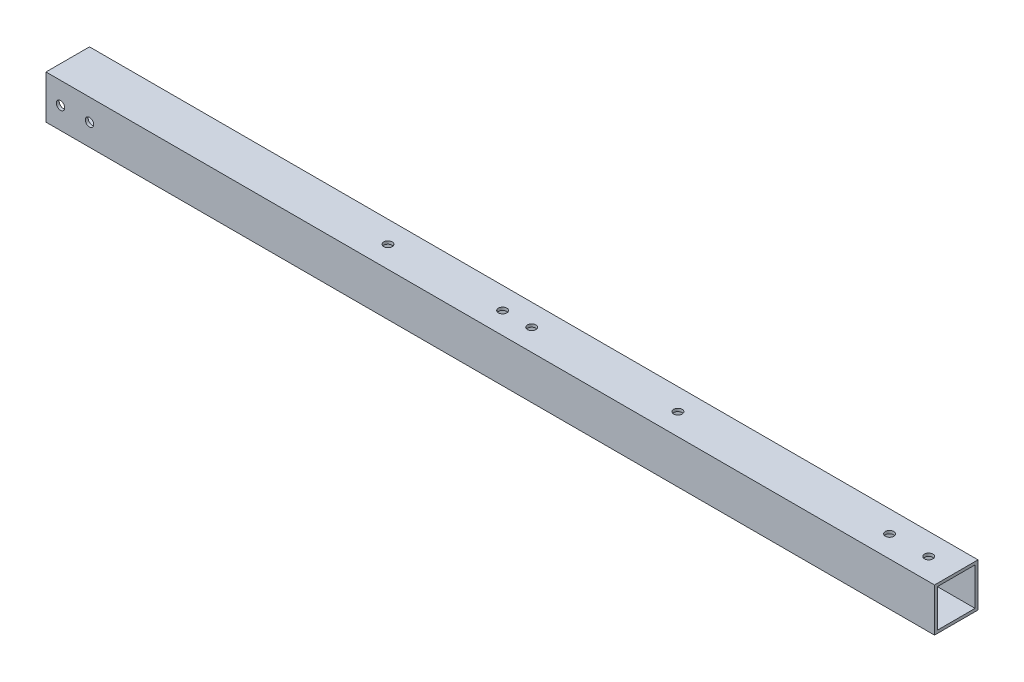
ISO-10303-21;
HEADER;
FILE_DESCRIPTION(('STEP AP214'),'2;1');
FILE_NAME('part.step','',(''),(''),'','','');
FILE_SCHEMA(('AUTOMOTIVE_DESIGN { 1 0 10303 214 1 1 1 1 }'));
ENDSEC;
DATA;
#1=APPLICATION_CONTEXT('core data for automotive mechanical design processes');
#2=APPLICATION_PROTOCOL_DEFINITION('international standard','automotive_design',2000,#1);
#3=PRODUCT_CONTEXT('',#1,'mechanical');
#4=PRODUCT('Part','Part','',(#3));
#5=PRODUCT_RELATED_PRODUCT_CATEGORY('part','',(#4));
#6=PRODUCT_DEFINITION_FORMATION('','',#4);
#7=PRODUCT_DEFINITION_CONTEXT('part definition',#1,'design');
#8=PRODUCT_DEFINITION('design','',#6,#7);
#9=PRODUCT_DEFINITION_SHAPE('','',#8);
#10=(LENGTH_UNIT() NAMED_UNIT(*) SI_UNIT(.MILLI.,.METRE.));
#11=(NAMED_UNIT(*) PLANE_ANGLE_UNIT() SI_UNIT($,.RADIAN.));
#12=(NAMED_UNIT(*) SI_UNIT($,.STERADIAN.) SOLID_ANGLE_UNIT());
#13=UNCERTAINTY_MEASURE_WITH_UNIT(LENGTH_MEASURE(1.E-05),#10,'distance_accuracy_value','');
#14=(GEOMETRIC_REPRESENTATION_CONTEXT(3) GLOBAL_UNCERTAINTY_ASSIGNED_CONTEXT((#13)) GLOBAL_UNIT_ASSIGNED_CONTEXT((#10,
#11,#12)) REPRESENTATION_CONTEXT('',''));
#15=CARTESIAN_POINT('',(0.,0.,0.));
#16=DIRECTION('',(0.,0.,1.));
#17=DIRECTION('',(1.,0.,0.));
#18=AXIS2_PLACEMENT_3D('',#15,#16,#17);
#19=CARTESIAN_POINT('',(306.44,0.,0.));
#20=DIRECTION('',(-1.,0.,0.));
#21=DIRECTION('',(0.,0.,1.));
#22=AXIS2_PLACEMENT_3D('',#19,#20,#21);
#23=PLANE('',#22);
#24=DIRECTION('',(0.,1.,0.));
#25=VECTOR('',#24,1.);
#26=CARTESIAN_POINT('',(306.44,-7.5,-7.5));
#27=LINE('',#26,#25);
#28=CARTESIAN_POINT('',(306.44,-7.5,-7.5));
#29=VERTEX_POINT('',#28);
#30=CARTESIAN_POINT('',(306.44,7.5,-7.5));
#31=VERTEX_POINT('',#30);
#32=EDGE_CURVE('E146',#29,#31,#27,.T.);
#33=ORIENTED_EDGE('',*,*,#32,.T.);
#34=DIRECTION('',(0.,0.,1.));
#35=VECTOR('',#34,1.);
#36=CARTESIAN_POINT('',(306.44,7.5,7.5));
#37=LINE('',#36,#35);
#38=CARTESIAN_POINT('',(306.44,7.5,7.5));
#39=VERTEX_POINT('',#38);
#40=EDGE_CURVE('E149',#31,#39,#37,.T.);
#41=ORIENTED_EDGE('',*,*,#40,.T.);
#42=DIRECTION('',(0.,-1.,0.));
#43=VECTOR('',#42,1.);
#44=CARTESIAN_POINT('',(306.44,-7.5,7.5));
#45=LINE('',#44,#43);
#46=CARTESIAN_POINT('',(306.44,-7.5,7.5));
#47=VERTEX_POINT('',#46);
#48=EDGE_CURVE('E152',#39,#47,#45,.T.);
#49=ORIENTED_EDGE('',*,*,#48,.T.);
#50=DIRECTION('',(0.,0.,-1.));
#51=VECTOR('',#50,1.);
#52=CARTESIAN_POINT('',(306.44,-7.5,7.5));
#53=LINE('',#52,#51);
#54=EDGE_CURVE('E154',#47,#29,#53,.T.);
#55=ORIENTED_EDGE('',*,*,#54,.T.);
#56=EDGE_LOOP('',(#33,#41,#49,#55));
#57=FACE_BOUND('',#56,.T.);
#58=DIRECTION('',(0.,0.,-1.));
#59=VECTOR('',#58,1.);
#60=CARTESIAN_POINT('',(306.44,-6.5,6.5));
#61=LINE('',#60,#59);
#62=CARTESIAN_POINT('',(306.44,-6.5,6.5));
#63=VERTEX_POINT('',#62);
#64=CARTESIAN_POINT('',(306.44,-6.5,-6.5));
#65=VERTEX_POINT('',#64);
#66=EDGE_CURVE('E108',#63,#65,#61,.T.);
#67=ORIENTED_EDGE('',*,*,#66,.F.);
#68=DIRECTION('',(0.,-1.,0.));
#69=VECTOR('',#68,1.);
#70=CARTESIAN_POINT('',(306.44,-6.5,6.5));
#71=LINE('',#70,#69);
#72=CARTESIAN_POINT('',(306.44,6.5,6.5));
#73=VERTEX_POINT('',#72);
#74=EDGE_CURVE('E130',#73,#63,#71,.T.);
#75=ORIENTED_EDGE('',*,*,#74,.F.);
#76=DIRECTION('',(0.,0.,1.));
#77=VECTOR('',#76,1.);
#78=CARTESIAN_POINT('',(306.44,6.5,6.5));
#79=LINE('',#78,#77);
#80=CARTESIAN_POINT('',(306.44,6.5,-6.5));
#81=VERTEX_POINT('',#80);
#82=EDGE_CURVE('E128',#81,#73,#79,.T.);
#83=ORIENTED_EDGE('',*,*,#82,.F.);
#84=DIRECTION('',(0.,1.,0.));
#85=VECTOR('',#84,1.);
#86=CARTESIAN_POINT('',(306.44,-6.5,-6.5));
#87=LINE('',#86,#85);
#88=EDGE_CURVE('E116',#65,#81,#87,.T.);
#89=ORIENTED_EDGE('',*,*,#88,.F.);
#90=EDGE_LOOP('',(#67,#75,#83,#89));
#91=FACE_BOUND('',#90,.T.);
#92=ADVANCED_FACE('F41',(#57,#91),#23,.F.);
#93=CARTESIAN_POINT('',(0.,0.,0.));
#94=DIRECTION('',(-1.,0.,0.));
#95=DIRECTION('',(0.,0.,1.));
#96=AXIS2_PLACEMENT_3D('',#93,#94,#95);
#97=PLANE('',#96);
#98=DIRECTION('',(0.,1.,0.));
#99=VECTOR('',#98,1.);
#100=CARTESIAN_POINT('',(0.,-7.5,-7.5));
#101=LINE('',#100,#99);
#102=CARTESIAN_POINT('',(0.,-7.5,-7.5));
#103=VERTEX_POINT('',#102);
#104=CARTESIAN_POINT('',(0.,7.5,-7.5));
#105=VERTEX_POINT('',#104);
#106=EDGE_CURVE('E124',#103,#105,#101,.T.);
#107=ORIENTED_EDGE('',*,*,#106,.F.);
#108=DIRECTION('',(0.,0.,-1.));
#109=VECTOR('',#108,1.);
#110=CARTESIAN_POINT('',(0.,-7.5,7.5));
#111=LINE('',#110,#109);
#112=CARTESIAN_POINT('',(0.,-7.5,7.5));
#113=VERTEX_POINT('',#112);
#114=EDGE_CURVE('E150',#113,#103,#111,.T.);
#115=ORIENTED_EDGE('',*,*,#114,.F.);
#116=DIRECTION('',(0.,-1.,0.));
#117=VECTOR('',#116,1.);
#118=CARTESIAN_POINT('',(0.,-7.5,7.5));
#119=LINE('',#118,#117);
#120=CARTESIAN_POINT('',(0.,7.5,7.5));
#121=VERTEX_POINT('',#120);
#122=EDGE_CURVE('E161',#121,#113,#119,.T.);
#123=ORIENTED_EDGE('',*,*,#122,.F.);
#124=DIRECTION('',(0.,0.,1.));
#125=VECTOR('',#124,1.);
#126=CARTESIAN_POINT('',(0.,7.5,7.5));
#127=LINE('',#126,#125);
#128=EDGE_CURVE('E159',#105,#121,#127,.T.);
#129=ORIENTED_EDGE('',*,*,#128,.F.);
#130=EDGE_LOOP('',(#107,#115,#123,#129));
#131=FACE_BOUND('',#130,.T.);
#132=DIRECTION('',(0.,-1.,0.));
#133=VECTOR('',#132,1.);
#134=CARTESIAN_POINT('',(0.,-6.5,6.5));
#135=LINE('',#134,#133);
#136=CARTESIAN_POINT('',(0.,6.5,6.5));
#137=VERTEX_POINT('',#136);
#138=CARTESIAN_POINT('',(0.,-6.5,6.5));
#139=VERTEX_POINT('',#138);
#140=EDGE_CURVE('E117',#137,#139,#135,.T.);
#141=ORIENTED_EDGE('',*,*,#140,.T.);
#142=DIRECTION('',(0.,0.,-1.));
#143=VECTOR('',#142,1.);
#144=CARTESIAN_POINT('',(0.,-6.5,6.5));
#145=LINE('',#144,#143);
#146=CARTESIAN_POINT('',(0.,-6.5,-6.5));
#147=VERTEX_POINT('',#146);
#148=EDGE_CURVE('E66',#139,#147,#145,.T.);
#149=ORIENTED_EDGE('',*,*,#148,.T.);
#150=DIRECTION('',(0.,1.,0.));
#151=VECTOR('',#150,1.);
#152=CARTESIAN_POINT('',(0.,-6.5,-6.5));
#153=LINE('',#152,#151);
#154=CARTESIAN_POINT('',(0.,6.5,-6.5));
#155=VERTEX_POINT('',#154);
#156=EDGE_CURVE('E123',#147,#155,#153,.T.);
#157=ORIENTED_EDGE('',*,*,#156,.T.);
#158=DIRECTION('',(0.,0.,1.));
#159=VECTOR('',#158,1.);
#160=CARTESIAN_POINT('',(0.,6.5,6.5));
#161=LINE('',#160,#159);
#162=EDGE_CURVE('E138',#155,#137,#161,.T.);
#163=ORIENTED_EDGE('',*,*,#162,.T.);
#164=EDGE_LOOP('',(#141,#149,#157,#163));
#165=FACE_BOUND('',#164,.T.);
#166=ADVANCED_FACE('F307',(#131,#165),#97,.T.);
#167=CARTESIAN_POINT('',(306.44,-7.5,-7.5));
#168=DIRECTION('',(0.,0.,1.));
#169=DIRECTION('',(1.,0.,0.));
#170=AXIS2_PLACEMENT_3D('',#167,#168,#169);
#171=PLANE('',#170);
#172=CARTESIAN_POINT('',(5.00000000000056,3.3678128369933E-13,-7.5));
#173=DIRECTION('',(0.,0.,-1.));
#174=DIRECTION('',(-1.,0.,0.));
#175=AXIS2_PLACEMENT_3D('',#172,#173,#174);
#176=CIRCLE('',#175,1.45);
#177=CARTESIAN_POINT('',(3.55000000000056,3.3678128369933E-13,-7.5));
#178=VERTEX_POINT('',#177);
#179=EDGE_CURVE('E203',#178,#178,#176,.T.);
#180=ORIENTED_EDGE('',*,*,#179,.F.);
#181=EDGE_LOOP('',(#180));
#182=FACE_BOUND('',#181,.T.);
#183=CARTESIAN_POINT('',(15.0000000000006,3.35443782797984E-13,-7.5));
#184=DIRECTION('',(0.,0.,-1.));
#185=DIRECTION('',(-1.,0.,0.));
#186=AXIS2_PLACEMENT_3D('',#183,#184,#185);
#187=CIRCLE('',#186,1.45);
#188=CARTESIAN_POINT('',(13.5500000000006,3.35443782797984E-13,-7.5));
#189=VERTEX_POINT('',#188);
#190=EDGE_CURVE('E208',#189,#189,#187,.T.);
#191=ORIENTED_EDGE('',*,*,#190,.F.);
#192=EDGE_LOOP('',(#191));
#193=FACE_BOUND('',#192,.T.);
#194=ORIENTED_EDGE('',*,*,#106,.T.);
#195=DIRECTION('',(-1.,0.,0.));
#196=VECTOR('',#195,1.);
#197=CARTESIAN_POINT('',(306.44,7.5,-7.5));
#198=LINE('',#197,#196);
#199=EDGE_CURVE('E11',#31,#105,#198,.T.);
#200=ORIENTED_EDGE('',*,*,#199,.F.);
#201=ORIENTED_EDGE('',*,*,#32,.F.);
#202=DIRECTION('',(-1.,0.,0.));
#203=VECTOR('',#202,1.);
#204=CARTESIAN_POINT('',(306.44,-7.5,-7.5));
#205=LINE('',#204,#203);
#206=EDGE_CURVE('E156',#29,#103,#205,.T.);
#207=ORIENTED_EDGE('',*,*,#206,.T.);
#208=EDGE_LOOP('',(#194,#200,#201,#207));
#209=FACE_BOUND('',#208,.T.);
#210=ADVANCED_FACE('F43',(#182,#193,#209),#171,.F.);
#211=CARTESIAN_POINT('',(306.44,7.5,7.5));
#212=DIRECTION('',(0.,-1.,0.));
#213=DIRECTION('',(0.,0.,-1.));
#214=AXIS2_PLACEMENT_3D('',#211,#212,#213);
#215=PLANE('',#214);
#216=CARTESIAN_POINT('',(110.44,7.5,0.));
#217=DIRECTION('',(0.,-1.,0.));
#218=DIRECTION('',(0.,0.,-1.));
#219=AXIS2_PLACEMENT_3D('',#216,#217,#218);
#220=CIRCLE('',#219,1.45);
#221=CARTESIAN_POINT('',(110.44,7.5,-1.45));
#222=VERTEX_POINT('',#221);
#223=EDGE_CURVE('E175',#222,#222,#220,.T.);
#224=ORIENTED_EDGE('',*,*,#223,.T.);
#225=EDGE_LOOP('',(#224));
#226=FACE_BOUND('',#225,.T.);
#227=CARTESIAN_POINT('',(160.,7.5,0.));
#228=DIRECTION('',(0.,-1.,0.));
#229=DIRECTION('',(0.,0.,-1.));
#230=AXIS2_PLACEMENT_3D('',#227,#228,#229);
#231=CIRCLE('',#230,1.45);
#232=CARTESIAN_POINT('',(160.,7.5,-1.45));
#233=VERTEX_POINT('',#232);
#234=EDGE_CURVE('E219',#233,#233,#231,.T.);
#235=ORIENTED_EDGE('',*,*,#234,.T.);
#236=EDGE_LOOP('',(#235));
#237=FACE_BOUND('',#236,.T.);
#238=CARTESIAN_POINT('',(210.44,7.5,0.));
#239=DIRECTION('',(0.,-1.,0.));
#240=DIRECTION('',(0.,0.,-1.));
#241=AXIS2_PLACEMENT_3D('',#238,#239,#240);
#242=CIRCLE('',#241,1.45);
#243=CARTESIAN_POINT('',(210.44,7.5,-1.45));
#244=VERTEX_POINT('',#243);
#245=EDGE_CURVE('E246',#244,#244,#242,.T.);
#246=ORIENTED_EDGE('',*,*,#245,.T.);
#247=EDGE_LOOP('',(#246));
#248=FACE_BOUND('',#247,.T.);
#249=CARTESIAN_POINT('',(283.440000000001,7.5,0.));
#250=DIRECTION('',(0.,-1.,0.));
#251=DIRECTION('',(0.,0.,-1.));
#252=AXIS2_PLACEMENT_3D('',#249,#250,#251);
#253=CIRCLE('',#252,1.45);
#254=CARTESIAN_POINT('',(283.440000000001,7.5,-1.45));
#255=VERTEX_POINT('',#254);
#256=EDGE_CURVE('E235',#255,#255,#253,.T.);
#257=ORIENTED_EDGE('',*,*,#256,.T.);
#258=EDGE_LOOP('',(#257));
#259=FACE_BOUND('',#258,.T.);
#260=CARTESIAN_POINT('',(296.940000000001,7.5,0.));
#261=DIRECTION('',(0.,-1.,0.));
#262=DIRECTION('',(0.,0.,-1.));
#263=AXIS2_PLACEMENT_3D('',#260,#261,#262);
#264=CIRCLE('',#263,1.45);
#265=CARTESIAN_POINT('',(296.940000000001,7.5,-1.44999999999999));
#266=VERTEX_POINT('',#265);
#267=EDGE_CURVE('E236',#266,#266,#264,.T.);
#268=ORIENTED_EDGE('',*,*,#267,.T.);
#269=EDGE_LOOP('',(#268));
#270=FACE_BOUND('',#269,.T.);
#271=CARTESIAN_POINT('',(150.000000000001,7.5,0.));
#272=DIRECTION('',(0.,-1.,0.));
#273=DIRECTION('',(0.,0.,-1.));
#274=AXIS2_PLACEMENT_3D('',#271,#272,#273);
#275=CIRCLE('',#274,1.45);
#276=CARTESIAN_POINT('',(150.000000000001,7.5,-1.45));
#277=VERTEX_POINT('',#276);
#278=EDGE_CURVE('E229',#277,#277,#275,.T.);
#279=ORIENTED_EDGE('',*,*,#278,.T.);
#280=EDGE_LOOP('',(#279));
#281=FACE_BOUND('',#280,.T.);
#282=ORIENTED_EDGE('',*,*,#128,.T.);
#283=DIRECTION('',(-1.,0.,0.));
#284=VECTOR('',#283,1.);
#285=CARTESIAN_POINT('',(306.44,7.5,7.5));
#286=LINE('',#285,#284);
#287=EDGE_CURVE('E50',#39,#121,#286,.T.);
#288=ORIENTED_EDGE('',*,*,#287,.F.);
#289=ORIENTED_EDGE('',*,*,#40,.F.);
#290=ORIENTED_EDGE('',*,*,#199,.T.);
#291=EDGE_LOOP('',(#282,#288,#289,#290));
#292=FACE_BOUND('',#291,.T.);
#293=ADVANCED_FACE('F311',(#226,#237,#248,#259,#270,#281,#292),#215,.F.);
#294=CARTESIAN_POINT('',(306.44,-7.5,7.5));
#295=DIRECTION('',(0.,0.,-1.));
#296=DIRECTION('',(-1.,0.,0.));
#297=AXIS2_PLACEMENT_3D('',#294,#295,#296);
#298=PLANE('',#297);
#299=CARTESIAN_POINT('',(5.00000000000056,3.3678128369933E-13,7.5));
#300=DIRECTION('',(0.,0.,-1.));
#301=DIRECTION('',(-1.,0.,0.));
#302=AXIS2_PLACEMENT_3D('',#299,#300,#301);
#303=CIRCLE('',#302,1.45);
#304=CARTESIAN_POINT('',(3.55000000000056,3.3678128369933E-13,7.5));
#305=VERTEX_POINT('',#304);
#306=EDGE_CURVE('E197',#305,#305,#303,.T.);
#307=ORIENTED_EDGE('',*,*,#306,.T.);
#308=EDGE_LOOP('',(#307));
#309=FACE_BOUND('',#308,.T.);
#310=CARTESIAN_POINT('',(15.0000000000006,3.35443782797984E-13,7.5));
#311=DIRECTION('',(0.,0.,-1.));
#312=DIRECTION('',(-1.,0.,0.));
#313=AXIS2_PLACEMENT_3D('',#310,#311,#312);
#314=CIRCLE('',#313,1.45);
#315=CARTESIAN_POINT('',(13.5500000000006,3.35443782797984E-13,7.5));
#316=VERTEX_POINT('',#315);
#317=EDGE_CURVE('E213',#316,#316,#314,.T.);
#318=ORIENTED_EDGE('',*,*,#317,.T.);
#319=EDGE_LOOP('',(#318));
#320=FACE_BOUND('',#319,.T.);
#321=ORIENTED_EDGE('',*,*,#122,.T.);
#322=DIRECTION('',(-1.,0.,0.));
#323=VECTOR('',#322,1.);
#324=CARTESIAN_POINT('',(306.44,-7.5,7.5));
#325=LINE('',#324,#323);
#326=EDGE_CURVE('E166',#47,#113,#325,.T.);
#327=ORIENTED_EDGE('',*,*,#326,.F.);
#328=ORIENTED_EDGE('',*,*,#48,.F.);
#329=ORIENTED_EDGE('',*,*,#287,.T.);
#330=EDGE_LOOP('',(#321,#327,#328,#329));
#331=FACE_BOUND('',#330,.T.);
#332=ADVANCED_FACE('F294',(#309,#320,#331),#298,.F.);
#333=CARTESIAN_POINT('',(306.44,-7.5,7.5));
#334=DIRECTION('',(0.,1.,0.));
#335=DIRECTION('',(0.,0.,1.));
#336=AXIS2_PLACEMENT_3D('',#333,#334,#335);
#337=PLANE('',#336);
#338=CARTESIAN_POINT('',(110.44,-7.5,0.));
#339=DIRECTION('',(0.,-1.,0.));
#340=DIRECTION('',(0.,0.,-1.));
#341=AXIS2_PLACEMENT_3D('',#338,#339,#340);
#342=CIRCLE('',#341,1.45);
#343=CARTESIAN_POINT('',(110.44,-7.5,-1.45));
#344=VERTEX_POINT('',#343);
#345=EDGE_CURVE('E222',#344,#344,#342,.T.);
#346=ORIENTED_EDGE('',*,*,#345,.F.);
#347=EDGE_LOOP('',(#346));
#348=FACE_BOUND('',#347,.T.);
#349=CARTESIAN_POINT('',(160.,-7.5,0.));
#350=DIRECTION('',(0.,-1.,0.));
#351=DIRECTION('',(0.,0.,-1.));
#352=AXIS2_PLACEMENT_3D('',#349,#350,#351);
#353=CIRCLE('',#352,1.45);
#354=CARTESIAN_POINT('',(160.,-7.5,-1.45));
#355=VERTEX_POINT('',#354);
#356=EDGE_CURVE('E226',#355,#355,#353,.T.);
#357=ORIENTED_EDGE('',*,*,#356,.F.);
#358=EDGE_LOOP('',(#357));
#359=FACE_BOUND('',#358,.T.);
#360=CARTESIAN_POINT('',(210.44,-7.5,0.));
#361=DIRECTION('',(0.,-1.,0.));
#362=DIRECTION('',(0.,0.,-1.));
#363=AXIS2_PLACEMENT_3D('',#360,#361,#362);
#364=CIRCLE('',#363,1.45);
#365=CARTESIAN_POINT('',(210.44,-7.5,-1.45));
#366=VERTEX_POINT('',#365);
#367=EDGE_CURVE('E225',#366,#366,#364,.T.);
#368=ORIENTED_EDGE('',*,*,#367,.F.);
#369=EDGE_LOOP('',(#368));
#370=FACE_BOUND('',#369,.T.);
#371=CARTESIAN_POINT('',(283.440000000001,-7.5,0.));
#372=DIRECTION('',(0.,-1.,0.));
#373=DIRECTION('',(0.,0.,-1.));
#374=AXIS2_PLACEMENT_3D('',#371,#372,#373);
#375=CIRCLE('',#374,1.45);
#376=CARTESIAN_POINT('',(283.440000000001,-7.5,-1.45));
#377=VERTEX_POINT('',#376);
#378=EDGE_CURVE('E249',#377,#377,#375,.T.);
#379=ORIENTED_EDGE('',*,*,#378,.F.);
#380=EDGE_LOOP('',(#379));
#381=FACE_BOUND('',#380,.T.);
#382=CARTESIAN_POINT('',(296.940000000001,-7.5,0.));
#383=DIRECTION('',(0.,-1.,0.));
#384=DIRECTION('',(0.,0.,-1.));
#385=AXIS2_PLACEMENT_3D('',#382,#383,#384);
#386=CIRCLE('',#385,1.45);
#387=CARTESIAN_POINT('',(296.940000000001,-7.5,-1.44999999999999));
#388=VERTEX_POINT('',#387);
#389=EDGE_CURVE('E232',#388,#388,#386,.T.);
#390=ORIENTED_EDGE('',*,*,#389,.F.);
#391=EDGE_LOOP('',(#390));
#392=FACE_BOUND('',#391,.T.);
#393=CARTESIAN_POINT('',(150.000000000001,-7.5,0.));
#394=DIRECTION('',(0.,-1.,0.));
#395=DIRECTION('',(0.,0.,-1.));
#396=AXIS2_PLACEMENT_3D('',#393,#394,#395);
#397=CIRCLE('',#396,1.45);
#398=CARTESIAN_POINT('',(150.000000000001,-7.5,-1.45));
#399=VERTEX_POINT('',#398);
#400=EDGE_CURVE('E239',#399,#399,#397,.T.);
#401=ORIENTED_EDGE('',*,*,#400,.F.);
#402=EDGE_LOOP('',(#401));
#403=FACE_BOUND('',#402,.T.);
#404=ORIENTED_EDGE('',*,*,#114,.T.);
#405=ORIENTED_EDGE('',*,*,#206,.F.);
#406=ORIENTED_EDGE('',*,*,#54,.F.);
#407=ORIENTED_EDGE('',*,*,#326,.T.);
#408=EDGE_LOOP('',(#404,#405,#406,#407));
#409=FACE_BOUND('',#408,.T.);
#410=ADVANCED_FACE('F271',(#348,#359,#370,#381,#392,#403,#409),#337,.F.);
#411=CARTESIAN_POINT('',(306.44,-6.5,6.5));
#412=DIRECTION('',(0.,1.,0.));
#413=DIRECTION('',(0.,0.,1.));
#414=AXIS2_PLACEMENT_3D('',#411,#412,#413);
#415=PLANE('',#414);
#416=CARTESIAN_POINT('',(110.44,-6.5,0.));
#417=DIRECTION('',(0.,1.,0.));
#418=DIRECTION('',(0.,0.,1.));
#419=AXIS2_PLACEMENT_3D('',#416,#417,#418);
#420=CIRCLE('',#419,1.45);
#421=CARTESIAN_POINT('',(110.44,-6.5,1.45));
#422=VERTEX_POINT('',#421);
#423=EDGE_CURVE('E136',#422,#422,#420,.T.);
#424=ORIENTED_EDGE('',*,*,#423,.F.);
#425=EDGE_LOOP('',(#424));
#426=FACE_BOUND('',#425,.T.);
#427=CARTESIAN_POINT('',(160.,-6.5,0.));
#428=DIRECTION('',(0.,1.,0.));
#429=DIRECTION('',(0.,0.,1.));
#430=AXIS2_PLACEMENT_3D('',#427,#428,#429);
#431=CIRCLE('',#430,1.45);
#432=CARTESIAN_POINT('',(160.,-6.5,1.45));
#433=VERTEX_POINT('',#432);
#434=EDGE_CURVE('E191',#433,#433,#431,.T.);
#435=ORIENTED_EDGE('',*,*,#434,.F.);
#436=EDGE_LOOP('',(#435));
#437=FACE_BOUND('',#436,.T.);
#438=CARTESIAN_POINT('',(210.44,-6.5,0.));
#439=DIRECTION('',(0.,1.,0.));
#440=DIRECTION('',(0.,0.,1.));
#441=AXIS2_PLACEMENT_3D('',#438,#439,#440);
#442=CIRCLE('',#441,1.45);
#443=CARTESIAN_POINT('',(210.44,-6.5,1.45));
#444=VERTEX_POINT('',#443);
#445=EDGE_CURVE('E187',#444,#444,#442,.T.);
#446=ORIENTED_EDGE('',*,*,#445,.F.);
#447=EDGE_LOOP('',(#446));
#448=FACE_BOUND('',#447,.T.);
#449=CARTESIAN_POINT('',(283.440000000001,-6.5,0.));
#450=DIRECTION('',(0.,1.,0.));
#451=DIRECTION('',(0.,0.,1.));
#452=AXIS2_PLACEMENT_3D('',#449,#450,#451);
#453=CIRCLE('',#452,1.45);
#454=CARTESIAN_POINT('',(283.440000000001,-6.5,1.45));
#455=VERTEX_POINT('',#454);
#456=EDGE_CURVE('E183',#455,#455,#453,.T.);
#457=ORIENTED_EDGE('',*,*,#456,.F.);
#458=EDGE_LOOP('',(#457));
#459=FACE_BOUND('',#458,.T.);
#460=CARTESIAN_POINT('',(296.940000000001,-6.5,0.));
#461=DIRECTION('',(0.,1.,0.));
#462=DIRECTION('',(0.,0.,1.));
#463=AXIS2_PLACEMENT_3D('',#460,#461,#462);
#464=CIRCLE('',#463,1.45);
#465=CARTESIAN_POINT('',(296.940000000001,-6.5,1.45000000000001));
#466=VERTEX_POINT('',#465);
#467=EDGE_CURVE('E179',#466,#466,#464,.T.);
#468=ORIENTED_EDGE('',*,*,#467,.F.);
#469=EDGE_LOOP('',(#468));
#470=FACE_BOUND('',#469,.T.);
#471=CARTESIAN_POINT('',(150.000000000001,-6.5,0.));
#472=DIRECTION('',(0.,1.,0.));
#473=DIRECTION('',(0.,0.,1.));
#474=AXIS2_PLACEMENT_3D('',#471,#472,#473);
#475=CIRCLE('',#474,1.45);
#476=CARTESIAN_POINT('',(150.000000000001,-6.5,1.45));
#477=VERTEX_POINT('',#476);
#478=EDGE_CURVE('E174',#477,#477,#475,.T.);
#479=ORIENTED_EDGE('',*,*,#478,.F.);
#480=EDGE_LOOP('',(#479));
#481=FACE_BOUND('',#480,.T.);
#482=ORIENTED_EDGE('',*,*,#148,.F.);
#483=DIRECTION('',(-1.,0.,0.));
#484=VECTOR('',#483,1.);
#485=CARTESIAN_POINT('',(306.44,-6.5,6.5));
#486=LINE('',#485,#484);
#487=EDGE_CURVE('E112',#63,#139,#486,.T.);
#488=ORIENTED_EDGE('',*,*,#487,.F.);
#489=ORIENTED_EDGE('',*,*,#66,.T.);
#490=DIRECTION('',(-1.,0.,0.));
#491=VECTOR('',#490,1.);
#492=CARTESIAN_POINT('',(306.44,-6.5,-6.5));
#493=LINE('',#492,#491);
#494=EDGE_CURVE('E111',#65,#147,#493,.T.);
#495=ORIENTED_EDGE('',*,*,#494,.T.);
#496=EDGE_LOOP('',(#482,#488,#489,#495));
#497=FACE_BOUND('',#496,.T.);
#498=ADVANCED_FACE('F110',(#426,#437,#448,#459,#470,#481,#497),#415,.T.);
#499=CARTESIAN_POINT('',(306.44,-6.5,-6.5));
#500=DIRECTION('',(0.,0.,1.));
#501=DIRECTION('',(0.,-1.,0.));
#502=AXIS2_PLACEMENT_3D('',#499,#500,#501);
#503=PLANE('',#502);
#504=CARTESIAN_POINT('',(5.00000000000056,3.3678128369933E-13,-6.5));
#505=DIRECTION('',(0.,0.,1.));
#506=DIRECTION('',(0.,-1.,0.));
#507=AXIS2_PLACEMENT_3D('',#504,#505,#506);
#508=CIRCLE('',#507,1.45);
#509=CARTESIAN_POINT('',(5.00000000000056,-1.44999999999966,-6.5));
#510=VERTEX_POINT('',#509);
#511=EDGE_CURVE('E216',#510,#510,#508,.T.);
#512=ORIENTED_EDGE('',*,*,#511,.F.);
#513=EDGE_LOOP('',(#512));
#514=FACE_BOUND('',#513,.T.);
#515=CARTESIAN_POINT('',(15.0000000000006,3.35443782797984E-13,-6.5));
#516=DIRECTION('',(0.,0.,1.));
#517=DIRECTION('',(0.,-1.,0.));
#518=AXIS2_PLACEMENT_3D('',#515,#516,#517);
#519=CIRCLE('',#518,1.45);
#520=CARTESIAN_POINT('',(15.0000000000006,-1.44999999999966,-6.5));
#521=VERTEX_POINT('',#520);
#522=EDGE_CURVE('E196',#521,#521,#519,.T.);
#523=ORIENTED_EDGE('',*,*,#522,.F.);
#524=EDGE_LOOP('',(#523));
#525=FACE_BOUND('',#524,.T.);
#526=ORIENTED_EDGE('',*,*,#156,.F.);
#527=ORIENTED_EDGE('',*,*,#494,.F.);
#528=ORIENTED_EDGE('',*,*,#88,.T.);
#529=DIRECTION('',(-1.,0.,0.));
#530=VECTOR('',#529,1.);
#531=CARTESIAN_POINT('',(306.44,6.5,-6.5));
#532=LINE('',#531,#530);
#533=EDGE_CURVE('E125',#81,#155,#532,.T.);
#534=ORIENTED_EDGE('',*,*,#533,.T.);
#535=EDGE_LOOP('',(#526,#527,#528,#534));
#536=FACE_BOUND('',#535,.T.);
#537=ADVANCED_FACE('F120',(#514,#525,#536),#503,.T.);
#538=CARTESIAN_POINT('',(306.44,6.5,6.5));
#539=DIRECTION('',(0.,-1.,0.));
#540=DIRECTION('',(0.,0.,-1.));
#541=AXIS2_PLACEMENT_3D('',#538,#539,#540);
#542=PLANE('',#541);
#543=CARTESIAN_POINT('',(110.44,6.5,0.));
#544=DIRECTION('',(0.,-1.,0.));
#545=DIRECTION('',(0.,0.,-1.));
#546=AXIS2_PLACEMENT_3D('',#543,#544,#545);
#547=CIRCLE('',#546,1.45);
#548=CARTESIAN_POINT('',(110.44,6.5,-1.45));
#549=VERTEX_POINT('',#548);
#550=EDGE_CURVE('E192',#549,#549,#547,.T.);
#551=ORIENTED_EDGE('',*,*,#550,.F.);
#552=EDGE_LOOP('',(#551));
#553=FACE_BOUND('',#552,.T.);
#554=CARTESIAN_POINT('',(160.,6.5,0.));
#555=DIRECTION('',(0.,-1.,0.));
#556=DIRECTION('',(0.,0.,-1.));
#557=AXIS2_PLACEMENT_3D('',#554,#555,#556);
#558=CIRCLE('',#557,1.45);
#559=CARTESIAN_POINT('',(160.,6.5,-1.45));
#560=VERTEX_POINT('',#559);
#561=EDGE_CURVE('E188',#560,#560,#558,.T.);
#562=ORIENTED_EDGE('',*,*,#561,.F.);
#563=EDGE_LOOP('',(#562));
#564=FACE_BOUND('',#563,.T.);
#565=CARTESIAN_POINT('',(210.44,6.5,0.));
#566=DIRECTION('',(0.,-1.,0.));
#567=DIRECTION('',(0.,0.,-1.));
#568=AXIS2_PLACEMENT_3D('',#565,#566,#567);
#569=CIRCLE('',#568,1.45);
#570=CARTESIAN_POINT('',(210.44,6.5,-1.45));
#571=VERTEX_POINT('',#570);
#572=EDGE_CURVE('E184',#571,#571,#569,.T.);
#573=ORIENTED_EDGE('',*,*,#572,.F.);
#574=EDGE_LOOP('',(#573));
#575=FACE_BOUND('',#574,.T.);
#576=CARTESIAN_POINT('',(283.440000000001,6.5,0.));
#577=DIRECTION('',(0.,-1.,0.));
#578=DIRECTION('',(0.,0.,-1.));
#579=AXIS2_PLACEMENT_3D('',#576,#577,#578);
#580=CIRCLE('',#579,1.45);
#581=CARTESIAN_POINT('',(283.440000000001,6.5,-1.45));
#582=VERTEX_POINT('',#581);
#583=EDGE_CURVE('E180',#582,#582,#580,.T.);
#584=ORIENTED_EDGE('',*,*,#583,.F.);
#585=EDGE_LOOP('',(#584));
#586=FACE_BOUND('',#585,.T.);
#587=CARTESIAN_POINT('',(296.940000000001,6.5,0.));
#588=DIRECTION('',(0.,-1.,0.));
#589=DIRECTION('',(0.,0.,-1.));
#590=AXIS2_PLACEMENT_3D('',#587,#588,#589);
#591=CIRCLE('',#590,1.45);
#592=CARTESIAN_POINT('',(296.940000000001,6.5,-1.44999999999999));
#593=VERTEX_POINT('',#592);
#594=EDGE_CURVE('E176',#593,#593,#591,.T.);
#595=ORIENTED_EDGE('',*,*,#594,.F.);
#596=EDGE_LOOP('',(#595));
#597=FACE_BOUND('',#596,.T.);
#598=CARTESIAN_POINT('',(150.000000000001,6.5,0.));
#599=DIRECTION('',(0.,-1.,0.));
#600=DIRECTION('',(0.,0.,-1.));
#601=AXIS2_PLACEMENT_3D('',#598,#599,#600);
#602=CIRCLE('',#601,1.45);
#603=CARTESIAN_POINT('',(150.000000000001,6.5,-1.45));
#604=VERTEX_POINT('',#603);
#605=EDGE_CURVE('E171',#604,#604,#602,.T.);
#606=ORIENTED_EDGE('',*,*,#605,.F.);
#607=EDGE_LOOP('',(#606));
#608=FACE_BOUND('',#607,.T.);
#609=ORIENTED_EDGE('',*,*,#162,.F.);
#610=ORIENTED_EDGE('',*,*,#533,.F.);
#611=ORIENTED_EDGE('',*,*,#82,.T.);
#612=DIRECTION('',(-1.,0.,0.));
#613=VECTOR('',#612,1.);
#614=CARTESIAN_POINT('',(306.44,6.5,6.5));
#615=LINE('',#614,#613);
#616=EDGE_CURVE('E58',#73,#137,#615,.T.);
#617=ORIENTED_EDGE('',*,*,#616,.T.);
#618=EDGE_LOOP('',(#609,#610,#611,#617));
#619=FACE_BOUND('',#618,.T.);
#620=ADVANCED_FACE('F332',(#553,#564,#575,#586,#597,#608,#619),#542,.T.);
#621=CARTESIAN_POINT('',(306.44,-6.5,6.5));
#622=DIRECTION('',(0.,0.,-1.));
#623=DIRECTION('',(-1.,0.,0.));
#624=AXIS2_PLACEMENT_3D('',#621,#622,#623);
#625=PLANE('',#624);
#626=CARTESIAN_POINT('',(5.00000000000056,3.3678128369933E-13,6.5));
#627=DIRECTION('',(0.,0.,-1.));
#628=DIRECTION('',(-1.,0.,0.));
#629=AXIS2_PLACEMENT_3D('',#626,#627,#628);
#630=CIRCLE('',#629,1.45);
#631=CARTESIAN_POINT('',(3.55000000000056,3.3678128369933E-13,6.5));
#632=VERTEX_POINT('',#631);
#633=EDGE_CURVE('E45',#632,#632,#630,.T.);
#634=ORIENTED_EDGE('',*,*,#633,.F.);
#635=EDGE_LOOP('',(#634));
#636=FACE_BOUND('',#635,.T.);
#637=CARTESIAN_POINT('',(15.0000000000006,3.35443782797984E-13,6.5));
#638=DIRECTION('',(0.,0.,-1.));
#639=DIRECTION('',(-1.,0.,0.));
#640=AXIS2_PLACEMENT_3D('',#637,#638,#639);
#641=CIRCLE('',#640,1.45);
#642=CARTESIAN_POINT('',(13.5500000000006,3.35443782797984E-13,6.5));
#643=VERTEX_POINT('',#642);
#644=EDGE_CURVE('E194',#643,#643,#641,.T.);
#645=ORIENTED_EDGE('',*,*,#644,.F.);
#646=EDGE_LOOP('',(#645));
#647=FACE_BOUND('',#646,.T.);
#648=ORIENTED_EDGE('',*,*,#140,.F.);
#649=ORIENTED_EDGE('',*,*,#616,.F.);
#650=ORIENTED_EDGE('',*,*,#74,.T.);
#651=ORIENTED_EDGE('',*,*,#487,.T.);
#652=EDGE_LOOP('',(#648,#649,#650,#651));
#653=FACE_BOUND('',#652,.T.);
#654=ADVANCED_FACE('F336',(#636,#647,#653),#625,.T.);
#655=CARTESIAN_POINT('',(150.000000000001,7.5,0.));
#656=DIRECTION('',(0.,-1.,0.));
#657=DIRECTION('',(0.,0.,-1.));
#658=AXIS2_PLACEMENT_3D('',#655,#656,#657);
#659=CYLINDRICAL_SURFACE('',#658,1.45);
#660=ORIENTED_EDGE('',*,*,#605,.T.);
#661=EDGE_LOOP('',(#660));
#662=FACE_BOUND('',#661,.T.);
#663=ORIENTED_EDGE('',*,*,#278,.F.);
#664=EDGE_LOOP('',(#663));
#665=FACE_BOUND('',#664,.T.);
#666=ADVANCED_FACE('F289',(#662,#665),#659,.F.);
#667=CARTESIAN_POINT('',(296.940000000001,7.5,0.));
#668=DIRECTION('',(0.,-1.,0.));
#669=DIRECTION('',(0.,0.,-1.));
#670=AXIS2_PLACEMENT_3D('',#667,#668,#669);
#671=CYLINDRICAL_SURFACE('',#670,1.45);
#672=ORIENTED_EDGE('',*,*,#594,.T.);
#673=EDGE_LOOP('',(#672));
#674=FACE_BOUND('',#673,.T.);
#675=ORIENTED_EDGE('',*,*,#267,.F.);
#676=EDGE_LOOP('',(#675));
#677=FACE_BOUND('',#676,.T.);
#678=ADVANCED_FACE('F345',(#674,#677),#671,.F.);
#679=CARTESIAN_POINT('',(283.440000000001,7.5,0.));
#680=DIRECTION('',(0.,-1.,0.));
#681=DIRECTION('',(0.,0.,-1.));
#682=AXIS2_PLACEMENT_3D('',#679,#680,#681);
#683=CYLINDRICAL_SURFACE('',#682,1.45);
#684=ORIENTED_EDGE('',*,*,#583,.T.);
#685=EDGE_LOOP('',(#684));
#686=FACE_BOUND('',#685,.T.);
#687=ORIENTED_EDGE('',*,*,#256,.F.);
#688=EDGE_LOOP('',(#687));
#689=FACE_BOUND('',#688,.T.);
#690=ADVANCED_FACE('F341',(#686,#689),#683,.F.);
#691=CARTESIAN_POINT('',(210.44,7.5,0.));
#692=DIRECTION('',(0.,-1.,0.));
#693=DIRECTION('',(0.,0.,-1.));
#694=AXIS2_PLACEMENT_3D('',#691,#692,#693);
#695=CYLINDRICAL_SURFACE('',#694,1.45);
#696=ORIENTED_EDGE('',*,*,#572,.T.);
#697=EDGE_LOOP('',(#696));
#698=FACE_BOUND('',#697,.T.);
#699=ORIENTED_EDGE('',*,*,#245,.F.);
#700=EDGE_LOOP('',(#699));
#701=FACE_BOUND('',#700,.T.);
#702=ADVANCED_FACE('F344',(#698,#701),#695,.F.);
#703=CARTESIAN_POINT('',(160.,7.5,0.));
#704=DIRECTION('',(0.,-1.,0.));
#705=DIRECTION('',(0.,0.,-1.));
#706=AXIS2_PLACEMENT_3D('',#703,#704,#705);
#707=CYLINDRICAL_SURFACE('',#706,1.45);
#708=ORIENTED_EDGE('',*,*,#561,.T.);
#709=EDGE_LOOP('',(#708));
#710=FACE_BOUND('',#709,.T.);
#711=ORIENTED_EDGE('',*,*,#234,.F.);
#712=EDGE_LOOP('',(#711));
#713=FACE_BOUND('',#712,.T.);
#714=ADVANCED_FACE('F349',(#710,#713),#707,.F.);
#715=CARTESIAN_POINT('',(110.44,7.5,0.));
#716=DIRECTION('',(0.,-1.,0.));
#717=DIRECTION('',(0.,0.,-1.));
#718=AXIS2_PLACEMENT_3D('',#715,#716,#717);
#719=CYLINDRICAL_SURFACE('',#718,1.45);
#720=ORIENTED_EDGE('',*,*,#550,.T.);
#721=EDGE_LOOP('',(#720));
#722=FACE_BOUND('',#721,.T.);
#723=ORIENTED_EDGE('',*,*,#223,.F.);
#724=EDGE_LOOP('',(#723));
#725=FACE_BOUND('',#724,.T.);
#726=ADVANCED_FACE('F287',(#722,#725),#719,.F.);
#727=ORIENTED_EDGE('',*,*,#478,.T.);
#728=EDGE_LOOP('',(#727));
#729=FACE_BOUND('',#728,.T.);
#730=ORIENTED_EDGE('',*,*,#400,.T.);
#731=EDGE_LOOP('',(#730));
#732=FACE_BOUND('',#731,.T.);
#733=ADVANCED_FACE('F283',(#729,#732),#659,.F.);
#734=ORIENTED_EDGE('',*,*,#467,.T.);
#735=EDGE_LOOP('',(#734));
#736=FACE_BOUND('',#735,.T.);
#737=ORIENTED_EDGE('',*,*,#389,.T.);
#738=EDGE_LOOP('',(#737));
#739=FACE_BOUND('',#738,.T.);
#740=ADVANCED_FACE('F286',(#736,#739),#671,.F.);
#741=ORIENTED_EDGE('',*,*,#456,.T.);
#742=EDGE_LOOP('',(#741));
#743=FACE_BOUND('',#742,.T.);
#744=ORIENTED_EDGE('',*,*,#378,.T.);
#745=EDGE_LOOP('',(#744));
#746=FACE_BOUND('',#745,.T.);
#747=ADVANCED_FACE('F347',(#743,#746),#683,.F.);
#748=ORIENTED_EDGE('',*,*,#445,.T.);
#749=EDGE_LOOP('',(#748));
#750=FACE_BOUND('',#749,.T.);
#751=ORIENTED_EDGE('',*,*,#367,.T.);
#752=EDGE_LOOP('',(#751));
#753=FACE_BOUND('',#752,.T.);
#754=ADVANCED_FACE('F351',(#750,#753),#695,.F.);
#755=ORIENTED_EDGE('',*,*,#434,.T.);
#756=EDGE_LOOP('',(#755));
#757=FACE_BOUND('',#756,.T.);
#758=ORIENTED_EDGE('',*,*,#356,.T.);
#759=EDGE_LOOP('',(#758));
#760=FACE_BOUND('',#759,.T.);
#761=ADVANCED_FACE('F361',(#757,#760),#707,.F.);
#762=ORIENTED_EDGE('',*,*,#423,.T.);
#763=EDGE_LOOP('',(#762));
#764=FACE_BOUND('',#763,.T.);
#765=ORIENTED_EDGE('',*,*,#345,.T.);
#766=EDGE_LOOP('',(#765));
#767=FACE_BOUND('',#766,.T.);
#768=ADVANCED_FACE('F266',(#764,#767),#719,.F.);
#769=CARTESIAN_POINT('',(15.0000000000006,3.35443782797984E-13,7.5));
#770=DIRECTION('',(0.,0.,-1.));
#771=DIRECTION('',(-1.,0.,0.));
#772=AXIS2_PLACEMENT_3D('',#769,#770,#771);
#773=CYLINDRICAL_SURFACE('',#772,1.45);
#774=ORIENTED_EDGE('',*,*,#644,.T.);
#775=EDGE_LOOP('',(#774));
#776=FACE_BOUND('',#775,.T.);
#777=ORIENTED_EDGE('',*,*,#317,.F.);
#778=EDGE_LOOP('',(#777));
#779=FACE_BOUND('',#778,.T.);
#780=ADVANCED_FACE('F365',(#776,#779),#773,.F.);
#781=CARTESIAN_POINT('',(5.00000000000056,3.3678128369933E-13,7.5));
#782=DIRECTION('',(0.,0.,-1.));
#783=DIRECTION('',(-1.,0.,0.));
#784=AXIS2_PLACEMENT_3D('',#781,#782,#783);
#785=CYLINDRICAL_SURFACE('',#784,1.45);
#786=ORIENTED_EDGE('',*,*,#633,.T.);
#787=EDGE_LOOP('',(#786));
#788=FACE_BOUND('',#787,.T.);
#789=ORIENTED_EDGE('',*,*,#306,.F.);
#790=EDGE_LOOP('',(#789));
#791=FACE_BOUND('',#790,.T.);
#792=ADVANCED_FACE('F368',(#788,#791),#785,.F.);
#793=ORIENTED_EDGE('',*,*,#522,.T.);
#794=EDGE_LOOP('',(#793));
#795=FACE_BOUND('',#794,.T.);
#796=ORIENTED_EDGE('',*,*,#190,.T.);
#797=EDGE_LOOP('',(#796));
#798=FACE_BOUND('',#797,.T.);
#799=ADVANCED_FACE('F369',(#795,#798),#773,.F.);
#800=ORIENTED_EDGE('',*,*,#511,.T.);
#801=EDGE_LOOP('',(#800));
#802=FACE_BOUND('',#801,.T.);
#803=ORIENTED_EDGE('',*,*,#179,.T.);
#804=EDGE_LOOP('',(#803));
#805=FACE_BOUND('',#804,.T.);
#806=ADVANCED_FACE('F372',(#802,#805),#785,.F.);
#807=CLOSED_SHELL('',(#92,#166,#210,#293,#332,#410,#498,#537,#620,#654,#666,#678,#690,#702,#714,
#726,#733,#740,#747,#754,#761,#768,#780,#792,#799,#806));
#808=MANIFOLD_SOLID_BREP('B2',#807);
#809=ADVANCED_BREP_SHAPE_REPRESENTATION('',(#18,#808),#14);
#810=SHAPE_DEFINITION_REPRESENTATION(#9,#809);
ENDSEC;
END-ISO-10303-21;
